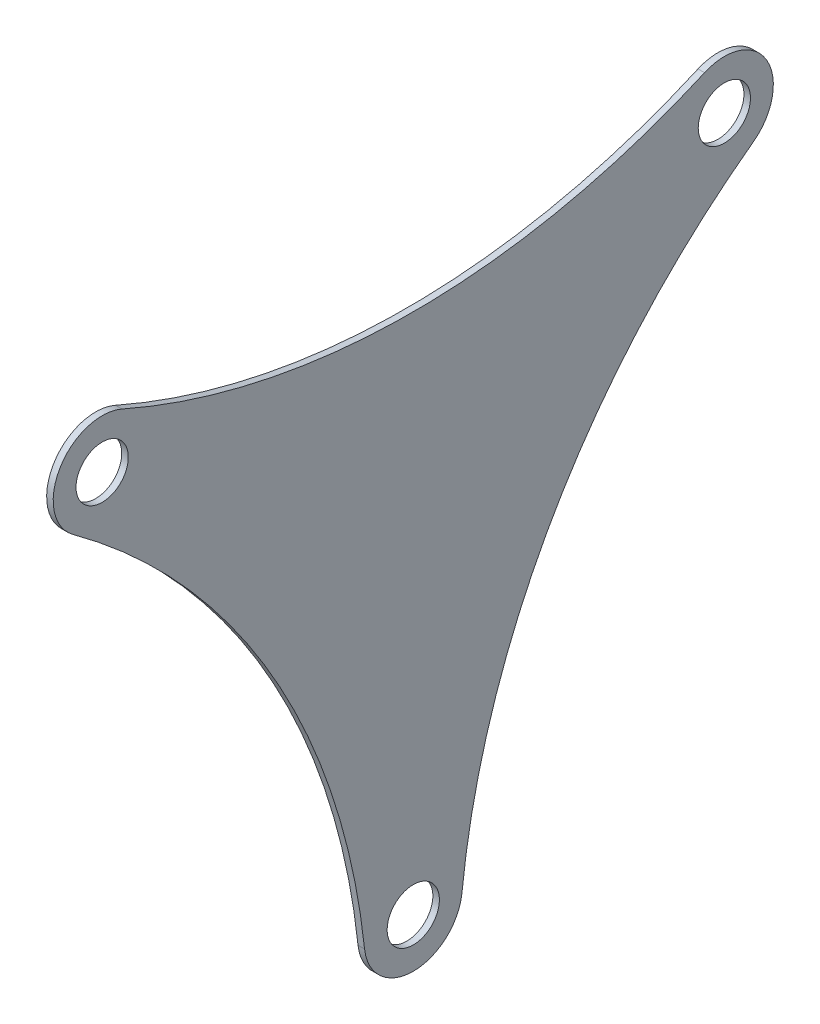
ISO-10303-21;
HEADER;
FILE_DESCRIPTION(('STEP AP214'),'2;1');
FILE_NAME('part.step','',(''),(''),'','','');
FILE_SCHEMA(('AUTOMOTIVE_DESIGN { 1 0 10303 214 1 1 1 1 }'));
ENDSEC;
DATA;
#1=APPLICATION_CONTEXT('core data for automotive mechanical design processes');
#2=APPLICATION_PROTOCOL_DEFINITION('international standard','automotive_design',2000,#1);
#3=PRODUCT_CONTEXT('',#1,'mechanical');
#4=PRODUCT('Part','Part','',(#3));
#5=PRODUCT_RELATED_PRODUCT_CATEGORY('part','',(#4));
#6=PRODUCT_DEFINITION_FORMATION('','',#4);
#7=PRODUCT_DEFINITION_CONTEXT('part definition',#1,'design');
#8=PRODUCT_DEFINITION('design','',#6,#7);
#9=PRODUCT_DEFINITION_SHAPE('','',#8);
#10=(LENGTH_UNIT() NAMED_UNIT(*) SI_UNIT(.MILLI.,.METRE.));
#11=(NAMED_UNIT(*) PLANE_ANGLE_UNIT() SI_UNIT($,.RADIAN.));
#12=(NAMED_UNIT(*) SI_UNIT($,.STERADIAN.) SOLID_ANGLE_UNIT());
#13=UNCERTAINTY_MEASURE_WITH_UNIT(LENGTH_MEASURE(1.E-05),#10,'distance_accuracy_value','');
#14=(GEOMETRIC_REPRESENTATION_CONTEXT(3) GLOBAL_UNCERTAINTY_ASSIGNED_CONTEXT((#13)) GLOBAL_UNIT_ASSIGNED_CONTEXT((#10,
#11,#12)) REPRESENTATION_CONTEXT('',''));
#15=CARTESIAN_POINT('',(0.,0.,0.));
#16=DIRECTION('',(0.,0.,1.));
#17=DIRECTION('',(1.,0.,0.));
#18=AXIS2_PLACEMENT_3D('',#15,#16,#17);
#19=CARTESIAN_POINT('',(-119.566920171404,-27.0625429868897,-46.87369943531));
#20=DIRECTION('',(1.,0.,0.));
#21=DIRECTION('',(0.,0.,-1.));
#22=AXIS2_PLACEMENT_3D('',#19,#20,#21);
#23=CYLINDRICAL_SURFACE('',#22,44.1462940245136);
#24=DIRECTION('',(1.,0.,0.));
#25=VECTOR('',#24,1.);
#26=CARTESIAN_POINT('',(-119.566920171404,8.57801474488549,-20.8228660385297));
#27=LINE('',#26,#25);
#28=CARTESIAN_POINT('',(-119.566920171404,8.57801474488549,-20.8228660385297));
#29=VERTEX_POINT('',#28);
#30=CARTESIAN_POINT('',(-119.166920171404,8.57801474488549,-20.8228660385297));
#31=VERTEX_POINT('',#30);
#32=EDGE_CURVE('E497',#29,#31,#27,.T.);
#33=ORIENTED_EDGE('',*,*,#32,.T.);
#34=CARTESIAN_POINT('',(-119.166920171404,-27.0625429868897,-46.87369943531));
#35=DIRECTION('',(-1.,0.,0.));
#36=DIRECTION('',(0.,0.,1.));
#37=AXIS2_PLACEMENT_3D('',#34,#35,#36);
#38=CIRCLE('',#37,44.1462940245136);
#39=CARTESIAN_POINT('',(-119.166920171404,-22.3221383414097,-2.9826543361566));
#40=VERTEX_POINT('',#39);
#41=EDGE_CURVE('E440',#31,#40,#38,.F.);
#42=ORIENTED_EDGE('',*,*,#41,.T.);
#43=DIRECTION('',(1.,0.,0.));
#44=VECTOR('',#43,1.);
#45=CARTESIAN_POINT('',(-119.566920171404,-22.3221383414097,-2.9826543361566));
#46=LINE('',#45,#44);
#47=CARTESIAN_POINT('',(-119.566920171404,-22.3221383414097,-2.9826543361566));
#48=VERTEX_POINT('',#47);
#49=EDGE_CURVE('E15',#48,#40,#46,.T.);
#50=ORIENTED_EDGE('',*,*,#49,.F.);
#51=CARTESIAN_POINT('',(-119.566920171404,-27.0625429868897,-46.87369943531));
#52=DIRECTION('',(1.,0.,0.));
#53=DIRECTION('',(0.,0.,1.));
#54=AXIS2_PLACEMENT_3D('',#51,#52,#53);
#55=CIRCLE('',#54,44.1462940245136);
#56=EDGE_CURVE('E540',#29,#48,#55,.T.);
#57=ORIENTED_EDGE('',*,*,#56,.F.);
#58=EDGE_LOOP('',(#33,#42,#50,#57));
#59=FACE_BOUND('',#58,.T.);
#60=ADVANCED_FACE('F424',(#59),#23,.F.);
#61=CARTESIAN_POINT('',(-119.566920171404,-22.,0.));
#62=DIRECTION('',(1.,0.,0.));
#63=DIRECTION('',(0.,0.,-1.));
#64=AXIS2_PLACEMENT_3D('',#61,#62,#63);
#65=CYLINDRICAL_SURFACE('',#64,2.99999999999999);
#66=ORIENTED_EDGE('',*,*,#49,.T.);
#67=CARTESIAN_POINT('',(-119.166920171404,-22.,0.));
#68=DIRECTION('',(-1.,0.,0.));
#69=DIRECTION('',(0.,0.,1.));
#70=AXIS2_PLACEMENT_3D('',#67,#68,#69);
#71=CIRCLE('',#70,2.99999999999999);
#72=CARTESIAN_POINT('',(-119.166920171404,-22.3221383414097,2.9826543361566));
#73=VERTEX_POINT('',#72);
#74=EDGE_CURVE('E530',#40,#73,#71,.T.);
#75=ORIENTED_EDGE('',*,*,#74,.T.);
#76=DIRECTION('',(1.,0.,0.));
#77=VECTOR('',#76,1.);
#78=CARTESIAN_POINT('',(-119.566920171404,-22.3221383414097,2.9826543361566));
#79=LINE('',#78,#77);
#80=CARTESIAN_POINT('',(-119.566920171404,-22.3221383414097,2.9826543361566));
#81=VERTEX_POINT('',#80);
#82=EDGE_CURVE('E432',#81,#73,#79,.T.);
#83=ORIENTED_EDGE('',*,*,#82,.F.);
#84=CARTESIAN_POINT('',(-119.566920171404,-22.,0.));
#85=DIRECTION('',(-1.,0.,0.));
#86=DIRECTION('',(0.,0.,1.));
#87=AXIS2_PLACEMENT_3D('',#84,#85,#86);
#88=CIRCLE('',#87,2.99999999999999);
#89=EDGE_CURVE('E547',#48,#81,#88,.T.);
#90=ORIENTED_EDGE('',*,*,#89,.F.);
#91=EDGE_LOOP('',(#66,#75,#83,#90));
#92=FACE_BOUND('',#91,.T.);
#93=ADVANCED_FACE('F557',(#92),#65,.T.);
#94=CARTESIAN_POINT('',(-119.566920171404,-27.0625429868899,46.87369943531));
#95=DIRECTION('',(1.,0.,0.));
#96=DIRECTION('',(0.,0.,-1.));
#97=AXIS2_PLACEMENT_3D('',#94,#95,#96);
#98=CYLINDRICAL_SURFACE('',#97,44.1462940245136);
#99=ORIENTED_EDGE('',*,*,#82,.T.);
#100=CARTESIAN_POINT('',(-119.166920171404,-27.0625429868899,46.87369943531));
#101=DIRECTION('',(-1.,0.,0.));
#102=DIRECTION('',(0.,0.,1.));
#103=AXIS2_PLACEMENT_3D('',#100,#101,#102);
#104=CIRCLE('',#103,44.1462940245136);
#105=CARTESIAN_POINT('',(-119.166920171404,8.57801474488536,20.8228660385297));
#106=VERTEX_POINT('',#105);
#107=EDGE_CURVE('E527',#73,#106,#104,.F.);
#108=ORIENTED_EDGE('',*,*,#107,.T.);
#109=DIRECTION('',(1.,0.,0.));
#110=VECTOR('',#109,1.);
#111=CARTESIAN_POINT('',(-119.566920171404,8.57801474488536,20.8228660385297));
#112=LINE('',#111,#110);
#113=CARTESIAN_POINT('',(-119.566920171404,8.57801474488536,20.8228660385297));
#114=VERTEX_POINT('',#113);
#115=EDGE_CURVE('E499',#114,#106,#112,.T.);
#116=ORIENTED_EDGE('',*,*,#115,.F.);
#117=CARTESIAN_POINT('',(-119.566920171404,-27.0625429868899,46.87369943531));
#118=DIRECTION('',(1.,0.,0.));
#119=DIRECTION('',(0.,0.,1.));
#120=AXIS2_PLACEMENT_3D('',#117,#118,#119);
#121=CIRCLE('',#120,44.1462940245136);
#122=EDGE_CURVE('E526',#81,#114,#121,.T.);
#123=ORIENTED_EDGE('',*,*,#122,.F.);
#124=EDGE_LOOP('',(#99,#108,#116,#123));
#125=FACE_BOUND('',#124,.T.);
#126=ADVANCED_FACE('F525',(#125),#98,.F.);
#127=CARTESIAN_POINT('',(-119.566920171404,11.,19.0525588832577));
#128=DIRECTION('',(1.,0.,0.));
#129=DIRECTION('',(0.,0.,-1.));
#130=AXIS2_PLACEMENT_3D('',#127,#128,#129);
#131=CYLINDRICAL_SURFACE('',#130,3.);
#132=ORIENTED_EDGE('',*,*,#115,.T.);
#133=CARTESIAN_POINT('',(-119.166920171404,11.,19.0525588832577));
#134=DIRECTION('',(-1.,0.,0.));
#135=DIRECTION('',(0.,0.,1.));
#136=AXIS2_PLACEMENT_3D('',#133,#134,#135);
#137=CIRCLE('',#136,3.);
#138=CARTESIAN_POINT('',(-119.166920171404,13.7441235965242,17.8402117023731));
#139=VERTEX_POINT('',#138);
#140=EDGE_CURVE('E494',#106,#139,#137,.T.);
#141=ORIENTED_EDGE('',*,*,#140,.T.);
#142=DIRECTION('',(1.,0.,0.));
#143=VECTOR('',#142,1.);
#144=CARTESIAN_POINT('',(-119.566920171404,13.7441235965242,17.8402117023731));
#145=LINE('',#144,#143);
#146=CARTESIAN_POINT('',(-119.566920171404,13.7441235965242,17.8402117023731));
#147=VERTEX_POINT('',#146);
#148=EDGE_CURVE('E493',#147,#139,#145,.T.);
#149=ORIENTED_EDGE('',*,*,#148,.F.);
#150=CARTESIAN_POINT('',(-119.566920171404,11.,19.0525588832577));
#151=DIRECTION('',(-1.,0.,0.));
#152=DIRECTION('',(0.,0.,1.));
#153=AXIS2_PLACEMENT_3D('',#150,#151,#152);
#154=CIRCLE('',#153,3.);
#155=EDGE_CURVE('E521',#114,#147,#154,.T.);
#156=ORIENTED_EDGE('',*,*,#155,.F.);
#157=EDGE_LOOP('',(#132,#141,#149,#156));
#158=FACE_BOUND('',#157,.T.);
#159=ADVANCED_FACE('F520',(#158),#131,.T.);
#160=CARTESIAN_POINT('',(-119.566920171404,54.1250859737797,1.74085641711794E-13));
#161=DIRECTION('',(1.,0.,0.));
#162=DIRECTION('',(0.,0.,-1.));
#163=AXIS2_PLACEMENT_3D('',#160,#161,#162);
#164=CYLINDRICAL_SURFACE('',#163,44.1462940245136);
#165=ORIENTED_EDGE('',*,*,#148,.T.);
#166=CARTESIAN_POINT('',(-119.166920171404,54.1250859737797,1.74085641711794E-13));
#167=DIRECTION('',(-1.,0.,0.));
#168=DIRECTION('',(0.,0.,1.));
#169=AXIS2_PLACEMENT_3D('',#166,#167,#168);
#170=CIRCLE('',#169,44.1462940245136);
#171=CARTESIAN_POINT('',(-119.166920171404,13.7441235965244,-17.8402117023731));
#172=VERTEX_POINT('',#171);
#173=EDGE_CURVE('E479',#139,#172,#170,.F.);
#174=ORIENTED_EDGE('',*,*,#173,.T.);
#175=DIRECTION('',(1.,0.,0.));
#176=VECTOR('',#175,1.);
#177=CARTESIAN_POINT('',(-119.566920171404,13.7441235965244,-17.8402117023731));
#178=LINE('',#177,#176);
#179=CARTESIAN_POINT('',(-119.566920171404,13.7441235965244,-17.8402117023731));
#180=VERTEX_POINT('',#179);
#181=EDGE_CURVE('E491',#180,#172,#178,.T.);
#182=ORIENTED_EDGE('',*,*,#181,.F.);
#183=CARTESIAN_POINT('',(-119.566920171404,54.1250859737797,1.74085641711794E-13));
#184=DIRECTION('',(1.,0.,0.));
#185=DIRECTION('',(0.,0.,1.));
#186=AXIS2_PLACEMENT_3D('',#183,#184,#185);
#187=CIRCLE('',#186,44.1462940245136);
#188=EDGE_CURVE('E551',#147,#180,#187,.T.);
#189=ORIENTED_EDGE('',*,*,#188,.F.);
#190=EDGE_LOOP('',(#165,#174,#182,#189));
#191=FACE_BOUND('',#190,.T.);
#192=ADVANCED_FACE('F489',(#191),#164,.F.);
#193=CARTESIAN_POINT('',(-119.566920171404,11.0000000000001,-19.0525588832576));
#194=DIRECTION('',(1.,0.,0.));
#195=DIRECTION('',(0.,0.,-1.));
#196=AXIS2_PLACEMENT_3D('',#193,#194,#195);
#197=CYLINDRICAL_SURFACE('',#196,3.);
#198=ORIENTED_EDGE('',*,*,#181,.T.);
#199=CARTESIAN_POINT('',(-119.166920171404,11.0000000000001,-19.0525588832576));
#200=DIRECTION('',(-1.,0.,0.));
#201=DIRECTION('',(0.,0.,1.));
#202=AXIS2_PLACEMENT_3D('',#199,#200,#201);
#203=CIRCLE('',#202,3.);
#204=EDGE_CURVE('E476',#172,#31,#203,.T.);
#205=ORIENTED_EDGE('',*,*,#204,.T.);
#206=ORIENTED_EDGE('',*,*,#32,.F.);
#207=CARTESIAN_POINT('',(-119.566920171404,11.0000000000001,-19.0525588832576));
#208=DIRECTION('',(-1.,0.,0.));
#209=DIRECTION('',(0.,0.,1.));
#210=AXIS2_PLACEMENT_3D('',#207,#208,#209);
#211=CIRCLE('',#210,3.);
#212=EDGE_CURVE('E448',#180,#29,#211,.T.);
#213=ORIENTED_EDGE('',*,*,#212,.F.);
#214=EDGE_LOOP('',(#198,#205,#206,#213));
#215=FACE_BOUND('',#214,.T.);
#216=ADVANCED_FACE('F496',(#215),#197,.T.);
#217=CARTESIAN_POINT('',(-119.566920171404,-8.03127149344481,-32.9631291592838));
#218=DIRECTION('',(-1.,0.,0.));
#219=DIRECTION('',(0.,0.,1.));
#220=AXIS2_PLACEMENT_3D('',#217,#218,#219);
#221=PLANE('',#220);
#222=CARTESIAN_POINT('',(-119.566920171404,11.,19.0525588832577));
#223=DIRECTION('',(-1.,0.,0.));
#224=DIRECTION('',(0.,0.,1.));
#225=AXIS2_PLACEMENT_3D('',#222,#223,#224);
#226=CIRCLE('',#225,1.6);
#227=CARTESIAN_POINT('',(-119.566920171404,11.,20.6525588832577));
#228=VERTEX_POINT('',#227);
#229=EDGE_CURVE('E537',#228,#228,#226,.T.);
#230=ORIENTED_EDGE('',*,*,#229,.F.);
#231=EDGE_LOOP('',(#230));
#232=FACE_BOUND('',#231,.T.);
#233=CARTESIAN_POINT('',(-119.566920171404,-22.,0.));
#234=DIRECTION('',(-1.,0.,0.));
#235=DIRECTION('',(0.,0.,1.));
#236=AXIS2_PLACEMENT_3D('',#233,#234,#235);
#237=CIRCLE('',#236,1.6);
#238=CARTESIAN_POINT('',(-119.566920171404,-22.,1.6));
#239=VERTEX_POINT('',#238);
#240=EDGE_CURVE('E541',#239,#239,#237,.T.);
#241=ORIENTED_EDGE('',*,*,#240,.F.);
#242=EDGE_LOOP('',(#241));
#243=FACE_BOUND('',#242,.T.);
#244=CARTESIAN_POINT('',(-119.566920171404,11.0000000000001,-19.0525588832576));
#245=DIRECTION('',(-1.,0.,0.));
#246=DIRECTION('',(0.,0.,1.));
#247=AXIS2_PLACEMENT_3D('',#244,#245,#246);
#248=CIRCLE('',#247,1.6);
#249=CARTESIAN_POINT('',(-119.566920171404,11.0000000000001,-17.4525588832576));
#250=VERTEX_POINT('',#249);
#251=EDGE_CURVE('E536',#250,#250,#248,.T.);
#252=ORIENTED_EDGE('',*,*,#251,.F.);
#253=EDGE_LOOP('',(#252));
#254=FACE_BOUND('',#253,.T.);
#255=ORIENTED_EDGE('',*,*,#56,.T.);
#256=ORIENTED_EDGE('',*,*,#89,.T.);
#257=ORIENTED_EDGE('',*,*,#122,.T.);
#258=ORIENTED_EDGE('',*,*,#155,.T.);
#259=ORIENTED_EDGE('',*,*,#188,.T.);
#260=ORIENTED_EDGE('',*,*,#212,.T.);
#261=EDGE_LOOP('',(#255,#256,#257,#258,#259,#260));
#262=FACE_BOUND('',#261,.T.);
#263=ADVANCED_FACE('F553',(#232,#243,#254,#262),#221,.T.);
#264=CARTESIAN_POINT('',(-104.566920171404,11.0000000000001,-19.0525588832576));
#265=DIRECTION('',(-1.,0.,0.));
#266=DIRECTION('',(0.,0.,1.));
#267=AXIS2_PLACEMENT_3D('',#264,#265,#266);
#268=CYLINDRICAL_SURFACE('',#267,1.6);
#269=CARTESIAN_POINT('',(-119.166920171404,11.0000000000001,-19.0525588832576));
#270=DIRECTION('',(-1.,0.,0.));
#271=DIRECTION('',(0.,0.,1.));
#272=AXIS2_PLACEMENT_3D('',#269,#270,#271);
#273=CIRCLE('',#272,1.6);
#274=CARTESIAN_POINT('',(-119.166920171404,11.0000000000001,-17.4525588832576));
#275=VERTEX_POINT('',#274);
#276=EDGE_CURVE('E484',#275,#275,#273,.F.);
#277=ORIENTED_EDGE('',*,*,#276,.T.);
#278=EDGE_LOOP('',(#277));
#279=FACE_BOUND('',#278,.T.);
#280=ORIENTED_EDGE('',*,*,#251,.T.);
#281=EDGE_LOOP('',(#280));
#282=FACE_BOUND('',#281,.T.);
#283=ADVANCED_FACE('F576',(#279,#282),#268,.F.);
#284=CARTESIAN_POINT('',(-104.566920171404,-22.,0.));
#285=DIRECTION('',(-1.,0.,0.));
#286=DIRECTION('',(0.,0.,1.));
#287=AXIS2_PLACEMENT_3D('',#284,#285,#286);
#288=CYLINDRICAL_SURFACE('',#287,1.6);
#289=CARTESIAN_POINT('',(-119.166920171404,-22.,0.));
#290=DIRECTION('',(-1.,0.,0.));
#291=DIRECTION('',(0.,0.,1.));
#292=AXIS2_PLACEMENT_3D('',#289,#290,#291);
#293=CIRCLE('',#292,1.6);
#294=CARTESIAN_POINT('',(-119.166920171404,-22.,1.6));
#295=VERTEX_POINT('',#294);
#296=EDGE_CURVE('E601',#295,#295,#293,.F.);
#297=ORIENTED_EDGE('',*,*,#296,.T.);
#298=EDGE_LOOP('',(#297));
#299=FACE_BOUND('',#298,.T.);
#300=ORIENTED_EDGE('',*,*,#240,.T.);
#301=EDGE_LOOP('',(#300));
#302=FACE_BOUND('',#301,.T.);
#303=ADVANCED_FACE('F580',(#299,#302),#288,.F.);
#304=CARTESIAN_POINT('',(-104.566920171404,11.,19.0525588832577));
#305=DIRECTION('',(-1.,0.,0.));
#306=DIRECTION('',(0.,0.,1.));
#307=AXIS2_PLACEMENT_3D('',#304,#305,#306);
#308=CYLINDRICAL_SURFACE('',#307,1.6);
#309=CARTESIAN_POINT('',(-119.166920171404,11.,19.0525588832577));
#310=DIRECTION('',(-1.,0.,0.));
#311=DIRECTION('',(0.,0.,1.));
#312=AXIS2_PLACEMENT_3D('',#309,#310,#311);
#313=CIRCLE('',#312,1.6);
#314=CARTESIAN_POINT('',(-119.166920171404,11.,20.6525588832577));
#315=VERTEX_POINT('',#314);
#316=EDGE_CURVE('E427',#315,#315,#313,.F.);
#317=ORIENTED_EDGE('',*,*,#316,.T.);
#318=EDGE_LOOP('',(#317));
#319=FACE_BOUND('',#318,.T.);
#320=ORIENTED_EDGE('',*,*,#229,.T.);
#321=EDGE_LOOP('',(#320));
#322=FACE_BOUND('',#321,.T.);
#323=ADVANCED_FACE('F584',(#319,#322),#308,.F.);
#324=CARTESIAN_POINT('',(-119.166920171404,0.,0.));
#325=DIRECTION('',(-1.,0.,0.));
#326=DIRECTION('',(0.,0.,1.));
#327=AXIS2_PLACEMENT_3D('',#324,#325,#326);
#328=PLANE('',#327);
#329=ORIENTED_EDGE('',*,*,#276,.F.);
#330=EDGE_LOOP('',(#329));
#331=FACE_BOUND('',#330,.T.);
#332=ORIENTED_EDGE('',*,*,#316,.F.);
#333=EDGE_LOOP('',(#332));
#334=FACE_BOUND('',#333,.T.);
#335=ORIENTED_EDGE('',*,*,#296,.F.);
#336=EDGE_LOOP('',(#335));
#337=FACE_BOUND('',#336,.T.);
#338=ORIENTED_EDGE('',*,*,#204,.F.);
#339=ORIENTED_EDGE('',*,*,#173,.F.);
#340=ORIENTED_EDGE('',*,*,#140,.F.);
#341=ORIENTED_EDGE('',*,*,#107,.F.);
#342=ORIENTED_EDGE('',*,*,#74,.F.);
#343=ORIENTED_EDGE('',*,*,#41,.F.);
#344=EDGE_LOOP('',(#338,#339,#340,#341,#342,#343));
#345=FACE_BOUND('',#344,.T.);
#346=ADVANCED_FACE('F478',(#331,#334,#337,#345),#328,.F.);
#347=CLOSED_SHELL('',(#60,#93,#126,#159,#192,#216,#263,#283,#303,#323,#346));
#348=MANIFOLD_SOLID_BREP('B2',#347);
#349=ADVANCED_BREP_SHAPE_REPRESENTATION('',(#18,#348),#14);
#350=SHAPE_DEFINITION_REPRESENTATION(#9,#349);
ENDSEC;
END-ISO-10303-21;
